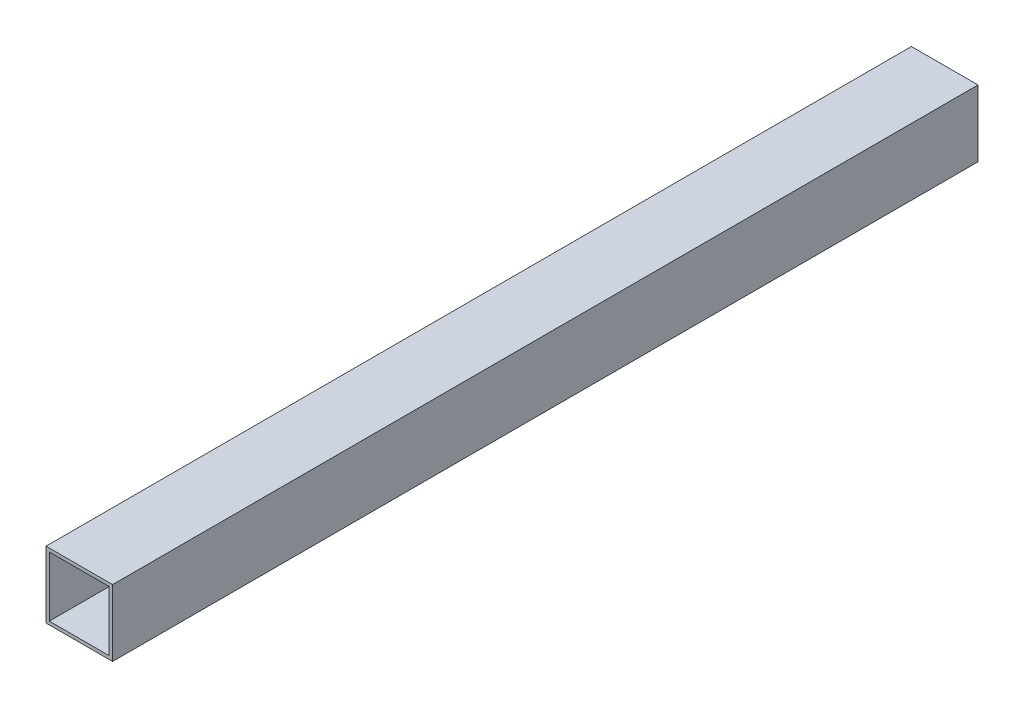
ISO-10303-21;
HEADER;
FILE_DESCRIPTION(('STEP AP214'),'2;1');
FILE_NAME('part.step','',(''),(''),'','','');
FILE_SCHEMA(('AUTOMOTIVE_DESIGN { 1 0 10303 214 1 1 1 1 }'));
ENDSEC;
DATA;
#1=APPLICATION_CONTEXT('core data for automotive mechanical design processes');
#2=APPLICATION_PROTOCOL_DEFINITION('international standard','automotive_design',2000,#1);
#3=PRODUCT_CONTEXT('',#1,'mechanical');
#4=PRODUCT('Part','Part','',(#3));
#5=PRODUCT_RELATED_PRODUCT_CATEGORY('part','',(#4));
#6=PRODUCT_DEFINITION_FORMATION('','',#4);
#7=PRODUCT_DEFINITION_CONTEXT('part definition',#1,'design');
#8=PRODUCT_DEFINITION('design','',#6,#7);
#9=PRODUCT_DEFINITION_SHAPE('','',#8);
#10=(LENGTH_UNIT() NAMED_UNIT(*) SI_UNIT(.MILLI.,.METRE.));
#11=(NAMED_UNIT(*) PLANE_ANGLE_UNIT() SI_UNIT($,.RADIAN.));
#12=(NAMED_UNIT(*) SI_UNIT($,.STERADIAN.) SOLID_ANGLE_UNIT());
#13=UNCERTAINTY_MEASURE_WITH_UNIT(LENGTH_MEASURE(1.E-05),#10,'distance_accuracy_value','');
#14=(GEOMETRIC_REPRESENTATION_CONTEXT(3) GLOBAL_UNCERTAINTY_ASSIGNED_CONTEXT((#13)) GLOBAL_UNIT_ASSIGNED_CONTEXT((#10,
#11,#12)) REPRESENTATION_CONTEXT('',''));
#15=CARTESIAN_POINT('',(0.,0.,0.));
#16=DIRECTION('',(0.,0.,1.));
#17=DIRECTION('',(1.,0.,0.));
#18=AXIS2_PLACEMENT_3D('',#15,#16,#17);
#19=CARTESIAN_POINT('',(0.,0.,260.));
#20=DIRECTION('',(0.,0.,-1.));
#21=DIRECTION('',(-1.,0.,0.));
#22=AXIS2_PLACEMENT_3D('',#19,#20,#21);
#23=PLANE('',#22);
#24=DIRECTION('',(0.,1.,0.));
#25=VECTOR('',#24,1.);
#26=CARTESIAN_POINT('',(10.,-10.,260.));
#27=LINE('',#26,#25);
#28=CARTESIAN_POINT('',(10.,-10.,260.));
#29=VERTEX_POINT('',#28);
#30=CARTESIAN_POINT('',(10.,10.,260.));
#31=VERTEX_POINT('',#30);
#32=EDGE_CURVE('E136',#29,#31,#27,.T.);
#33=ORIENTED_EDGE('',*,*,#32,.T.);
#34=DIRECTION('',(-1.,0.,0.));
#35=VECTOR('',#34,1.);
#36=CARTESIAN_POINT('',(-10.,10.,260.));
#37=LINE('',#36,#35);
#38=CARTESIAN_POINT('',(-10.,10.,260.));
#39=VERTEX_POINT('',#38);
#40=EDGE_CURVE('E139',#31,#39,#37,.T.);
#41=ORIENTED_EDGE('',*,*,#40,.T.);
#42=DIRECTION('',(0.,-1.,0.));
#43=VECTOR('',#42,1.);
#44=CARTESIAN_POINT('',(-10.,-10.,260.));
#45=LINE('',#44,#43);
#46=CARTESIAN_POINT('',(-10.,-10.,260.));
#47=VERTEX_POINT('',#46);
#48=EDGE_CURVE('E142',#39,#47,#45,.T.);
#49=ORIENTED_EDGE('',*,*,#48,.T.);
#50=DIRECTION('',(1.,0.,0.));
#51=VECTOR('',#50,1.);
#52=CARTESIAN_POINT('',(-10.,-10.,260.));
#53=LINE('',#52,#51);
#54=EDGE_CURVE('E144',#47,#29,#53,.T.);
#55=ORIENTED_EDGE('',*,*,#54,.T.);
#56=EDGE_LOOP('',(#33,#41,#49,#55));
#57=FACE_BOUND('',#56,.T.);
#58=DIRECTION('',(0.,-1.,0.));
#59=VECTOR('',#58,1.);
#60=CARTESIAN_POINT('',(-9.,-9.00000000000001,260.));
#61=LINE('',#60,#59);
#62=CARTESIAN_POINT('',(-9.,9.,260.));
#63=VERTEX_POINT('',#62);
#64=CARTESIAN_POINT('',(-9.,-9.00000000000001,260.));
#65=VERTEX_POINT('',#64);
#66=EDGE_CURVE('E100',#63,#65,#61,.T.);
#67=ORIENTED_EDGE('',*,*,#66,.F.);
#68=DIRECTION('',(-1.,0.,0.));
#69=VECTOR('',#68,1.);
#70=CARTESIAN_POINT('',(-9.,9.,260.));
#71=LINE('',#70,#69);
#72=CARTESIAN_POINT('',(9.,9.,260.));
#73=VERTEX_POINT('',#72);
#74=EDGE_CURVE('E122',#73,#63,#71,.T.);
#75=ORIENTED_EDGE('',*,*,#74,.F.);
#76=DIRECTION('',(0.,1.,0.));
#77=VECTOR('',#76,1.);
#78=CARTESIAN_POINT('',(9.,-9.00000000000001,260.));
#79=LINE('',#78,#77);
#80=CARTESIAN_POINT('',(9.,-9.00000000000001,260.));
#81=VERTEX_POINT('',#80);
#82=EDGE_CURVE('E120',#81,#73,#79,.T.);
#83=ORIENTED_EDGE('',*,*,#82,.F.);
#84=DIRECTION('',(1.,0.,0.));
#85=VECTOR('',#84,1.);
#86=CARTESIAN_POINT('',(-9.,-9.00000000000001,260.));
#87=LINE('',#86,#85);
#88=EDGE_CURVE('E108',#65,#81,#87,.T.);
#89=ORIENTED_EDGE('',*,*,#88,.F.);
#90=EDGE_LOOP('',(#67,#75,#83,#89));
#91=FACE_BOUND('',#90,.T.);
#92=ADVANCED_FACE('F35',(#57,#91),#23,.F.);
#93=CARTESIAN_POINT('',(0.,0.,0.));
#94=DIRECTION('',(0.,0.,-1.));
#95=DIRECTION('',(-1.,0.,0.));
#96=AXIS2_PLACEMENT_3D('',#93,#94,#95);
#97=PLANE('',#96);
#98=DIRECTION('',(0.,1.,0.));
#99=VECTOR('',#98,1.);
#100=CARTESIAN_POINT('',(10.,-10.,0.));
#101=LINE('',#100,#99);
#102=CARTESIAN_POINT('',(10.,-10.,0.));
#103=VERTEX_POINT('',#102);
#104=CARTESIAN_POINT('',(10.,10.,0.));
#105=VERTEX_POINT('',#104);
#106=EDGE_CURVE('E116',#103,#105,#101,.T.);
#107=ORIENTED_EDGE('',*,*,#106,.F.);
#108=DIRECTION('',(1.,0.,0.));
#109=VECTOR('',#108,1.);
#110=CARTESIAN_POINT('',(-10.,-10.,0.));
#111=LINE('',#110,#109);
#112=CARTESIAN_POINT('',(-10.,-10.,0.));
#113=VERTEX_POINT('',#112);
#114=EDGE_CURVE('E140',#113,#103,#111,.T.);
#115=ORIENTED_EDGE('',*,*,#114,.F.);
#116=DIRECTION('',(0.,-1.,0.));
#117=VECTOR('',#116,1.);
#118=CARTESIAN_POINT('',(-10.,-10.,0.));
#119=LINE('',#118,#117);
#120=CARTESIAN_POINT('',(-10.,10.,0.));
#121=VERTEX_POINT('',#120);
#122=EDGE_CURVE('E151',#121,#113,#119,.T.);
#123=ORIENTED_EDGE('',*,*,#122,.F.);
#124=DIRECTION('',(-1.,0.,0.));
#125=VECTOR('',#124,1.);
#126=CARTESIAN_POINT('',(-10.,10.,0.));
#127=LINE('',#126,#125);
#128=EDGE_CURVE('E149',#105,#121,#127,.T.);
#129=ORIENTED_EDGE('',*,*,#128,.F.);
#130=EDGE_LOOP('',(#107,#115,#123,#129));
#131=FACE_BOUND('',#130,.T.);
#132=DIRECTION('',(-1.,0.,0.));
#133=VECTOR('',#132,1.);
#134=CARTESIAN_POINT('',(-9.,9.,0.));
#135=LINE('',#134,#133);
#136=CARTESIAN_POINT('',(9.,9.,0.));
#137=VERTEX_POINT('',#136);
#138=CARTESIAN_POINT('',(-9.,9.,0.));
#139=VERTEX_POINT('',#138);
#140=EDGE_CURVE('E109',#137,#139,#135,.T.);
#141=ORIENTED_EDGE('',*,*,#140,.T.);
#142=DIRECTION('',(0.,-1.,0.));
#143=VECTOR('',#142,1.);
#144=CARTESIAN_POINT('',(-9.,-9.00000000000001,0.));
#145=LINE('',#144,#143);
#146=CARTESIAN_POINT('',(-9.,-9.00000000000001,0.));
#147=VERTEX_POINT('',#146);
#148=EDGE_CURVE('E58',#139,#147,#145,.T.);
#149=ORIENTED_EDGE('',*,*,#148,.T.);
#150=DIRECTION('',(1.,0.,0.));
#151=VECTOR('',#150,1.);
#152=CARTESIAN_POINT('',(-9.,-9.00000000000001,0.));
#153=LINE('',#152,#151);
#154=CARTESIAN_POINT('',(9.,-9.00000000000001,0.));
#155=VERTEX_POINT('',#154);
#156=EDGE_CURVE('E115',#147,#155,#153,.T.);
#157=ORIENTED_EDGE('',*,*,#156,.T.);
#158=DIRECTION('',(0.,1.,0.));
#159=VECTOR('',#158,1.);
#160=CARTESIAN_POINT('',(9.,-9.00000000000001,0.));
#161=LINE('',#160,#159);
#162=EDGE_CURVE('E128',#155,#137,#161,.T.);
#163=ORIENTED_EDGE('',*,*,#162,.T.);
#164=EDGE_LOOP('',(#141,#149,#157,#163));
#165=FACE_BOUND('',#164,.T.);
#166=ADVANCED_FACE('F169',(#131,#165),#97,.T.);
#167=CARTESIAN_POINT('',(10.,-10.,260.));
#168=DIRECTION('',(-1.,0.,0.));
#169=DIRECTION('',(0.,0.,1.));
#170=AXIS2_PLACEMENT_3D('',#167,#168,#169);
#171=PLANE('',#170);
#172=ORIENTED_EDGE('',*,*,#106,.T.);
#173=DIRECTION('',(0.,0.,-1.));
#174=VECTOR('',#173,1.);
#175=CARTESIAN_POINT('',(10.,10.,260.));
#176=LINE('',#175,#174);
#177=EDGE_CURVE('E11',#31,#105,#176,.T.);
#178=ORIENTED_EDGE('',*,*,#177,.F.);
#179=ORIENTED_EDGE('',*,*,#32,.F.);
#180=DIRECTION('',(0.,0.,-1.));
#181=VECTOR('',#180,1.);
#182=CARTESIAN_POINT('',(10.,-10.,260.));
#183=LINE('',#182,#181);
#184=EDGE_CURVE('E146',#29,#103,#183,.T.);
#185=ORIENTED_EDGE('',*,*,#184,.T.);
#186=EDGE_LOOP('',(#172,#178,#179,#185));
#187=FACE_BOUND('',#186,.T.);
#188=ADVANCED_FACE('F37',(#187),#171,.F.);
#189=CARTESIAN_POINT('',(-10.,10.,260.));
#190=DIRECTION('',(0.,-1.,0.));
#191=DIRECTION('',(0.,0.,-1.));
#192=AXIS2_PLACEMENT_3D('',#189,#190,#191);
#193=PLANE('',#192);
#194=ORIENTED_EDGE('',*,*,#128,.T.);
#195=DIRECTION('',(0.,0.,-1.));
#196=VECTOR('',#195,1.);
#197=CARTESIAN_POINT('',(-10.,10.,260.));
#198=LINE('',#197,#196);
#199=EDGE_CURVE('E43',#39,#121,#198,.T.);
#200=ORIENTED_EDGE('',*,*,#199,.F.);
#201=ORIENTED_EDGE('',*,*,#40,.F.);
#202=ORIENTED_EDGE('',*,*,#177,.T.);
#203=EDGE_LOOP('',(#194,#200,#201,#202));
#204=FACE_BOUND('',#203,.T.);
#205=ADVANCED_FACE('F179',(#204),#193,.F.);
#206=CARTESIAN_POINT('',(-10.,-10.,260.));
#207=DIRECTION('',(1.,0.,0.));
#208=DIRECTION('',(0.,0.,-1.));
#209=AXIS2_PLACEMENT_3D('',#206,#207,#208);
#210=PLANE('',#209);
#211=ORIENTED_EDGE('',*,*,#122,.T.);
#212=DIRECTION('',(0.,0.,-1.));
#213=VECTOR('',#212,1.);
#214=CARTESIAN_POINT('',(-10.,-10.,260.));
#215=LINE('',#214,#213);
#216=EDGE_CURVE('E156',#47,#113,#215,.T.);
#217=ORIENTED_EDGE('',*,*,#216,.F.);
#218=ORIENTED_EDGE('',*,*,#48,.F.);
#219=ORIENTED_EDGE('',*,*,#199,.T.);
#220=EDGE_LOOP('',(#211,#217,#218,#219));
#221=FACE_BOUND('',#220,.T.);
#222=ADVANCED_FACE('F163',(#221),#210,.F.);
#223=CARTESIAN_POINT('',(-10.,-10.,260.));
#224=DIRECTION('',(0.,1.,0.));
#225=DIRECTION('',(0.,0.,1.));
#226=AXIS2_PLACEMENT_3D('',#223,#224,#225);
#227=PLANE('',#226);
#228=ORIENTED_EDGE('',*,*,#114,.T.);
#229=ORIENTED_EDGE('',*,*,#184,.F.);
#230=ORIENTED_EDGE('',*,*,#54,.F.);
#231=ORIENTED_EDGE('',*,*,#216,.T.);
#232=EDGE_LOOP('',(#228,#229,#230,#231));
#233=FACE_BOUND('',#232,.T.);
#234=ADVANCED_FACE('F173',(#233),#227,.F.);
#235=CARTESIAN_POINT('',(-9.,-9.00000000000001,260.));
#236=DIRECTION('',(1.,0.,0.));
#237=DIRECTION('',(0.,0.,-1.));
#238=AXIS2_PLACEMENT_3D('',#235,#236,#237);
#239=PLANE('',#238);
#240=ORIENTED_EDGE('',*,*,#148,.F.);
#241=DIRECTION('',(0.,0.,-1.));
#242=VECTOR('',#241,1.);
#243=CARTESIAN_POINT('',(-9.,9.,260.));
#244=LINE('',#243,#242);
#245=EDGE_CURVE('E104',#63,#139,#244,.T.);
#246=ORIENTED_EDGE('',*,*,#245,.F.);
#247=ORIENTED_EDGE('',*,*,#66,.T.);
#248=DIRECTION('',(0.,0.,-1.));
#249=VECTOR('',#248,1.);
#250=CARTESIAN_POINT('',(-9.,-9.00000000000001,260.));
#251=LINE('',#250,#249);
#252=EDGE_CURVE('E103',#65,#147,#251,.T.);
#253=ORIENTED_EDGE('',*,*,#252,.T.);
#254=EDGE_LOOP('',(#240,#246,#247,#253));
#255=FACE_BOUND('',#254,.T.);
#256=ADVANCED_FACE('F102',(#255),#239,.T.);
#257=CARTESIAN_POINT('',(-9.,-9.00000000000001,260.));
#258=DIRECTION('',(0.,1.,0.));
#259=DIRECTION('',(0.,0.,1.));
#260=AXIS2_PLACEMENT_3D('',#257,#258,#259);
#261=PLANE('',#260);
#262=ORIENTED_EDGE('',*,*,#156,.F.);
#263=ORIENTED_EDGE('',*,*,#252,.F.);
#264=ORIENTED_EDGE('',*,*,#88,.T.);
#265=DIRECTION('',(0.,0.,-1.));
#266=VECTOR('',#265,1.);
#267=CARTESIAN_POINT('',(9.,-9.00000000000001,260.));
#268=LINE('',#267,#266);
#269=EDGE_CURVE('E117',#81,#155,#268,.T.);
#270=ORIENTED_EDGE('',*,*,#269,.T.);
#271=EDGE_LOOP('',(#262,#263,#264,#270));
#272=FACE_BOUND('',#271,.T.);
#273=ADVANCED_FACE('F112',(#272),#261,.T.);
#274=CARTESIAN_POINT('',(9.,-9.00000000000001,260.));
#275=DIRECTION('',(-1.,0.,0.));
#276=DIRECTION('',(0.,0.,1.));
#277=AXIS2_PLACEMENT_3D('',#274,#275,#276);
#278=PLANE('',#277);
#279=ORIENTED_EDGE('',*,*,#162,.F.);
#280=ORIENTED_EDGE('',*,*,#269,.F.);
#281=ORIENTED_EDGE('',*,*,#82,.T.);
#282=DIRECTION('',(0.,0.,-1.));
#283=VECTOR('',#282,1.);
#284=CARTESIAN_POINT('',(9.,9.,260.));
#285=LINE('',#284,#283);
#286=EDGE_CURVE('E50',#73,#137,#285,.T.);
#287=ORIENTED_EDGE('',*,*,#286,.T.);
#288=EDGE_LOOP('',(#279,#280,#281,#287));
#289=FACE_BOUND('',#288,.T.);
#290=ADVANCED_FACE('F202',(#289),#278,.T.);
#291=CARTESIAN_POINT('',(-9.,9.,260.));
#292=DIRECTION('',(0.,-1.,0.));
#293=DIRECTION('',(1.,0.,0.));
#294=AXIS2_PLACEMENT_3D('',#291,#292,#293);
#295=PLANE('',#294);
#296=ORIENTED_EDGE('',*,*,#140,.F.);
#297=ORIENTED_EDGE('',*,*,#286,.F.);
#298=ORIENTED_EDGE('',*,*,#74,.T.);
#299=ORIENTED_EDGE('',*,*,#245,.T.);
#300=EDGE_LOOP('',(#296,#297,#298,#299));
#301=FACE_BOUND('',#300,.T.);
#302=ADVANCED_FACE('F206',(#301),#295,.T.);
#303=CLOSED_SHELL('',(#92,#166,#188,#205,#222,#234,#256,#273,#290,#302));
#304=MANIFOLD_SOLID_BREP('B2',#303);
#305=ADVANCED_BREP_SHAPE_REPRESENTATION('',(#18,#304),#14);
#306=SHAPE_DEFINITION_REPRESENTATION(#9,#305);
ENDSEC;
END-ISO-10303-21;
